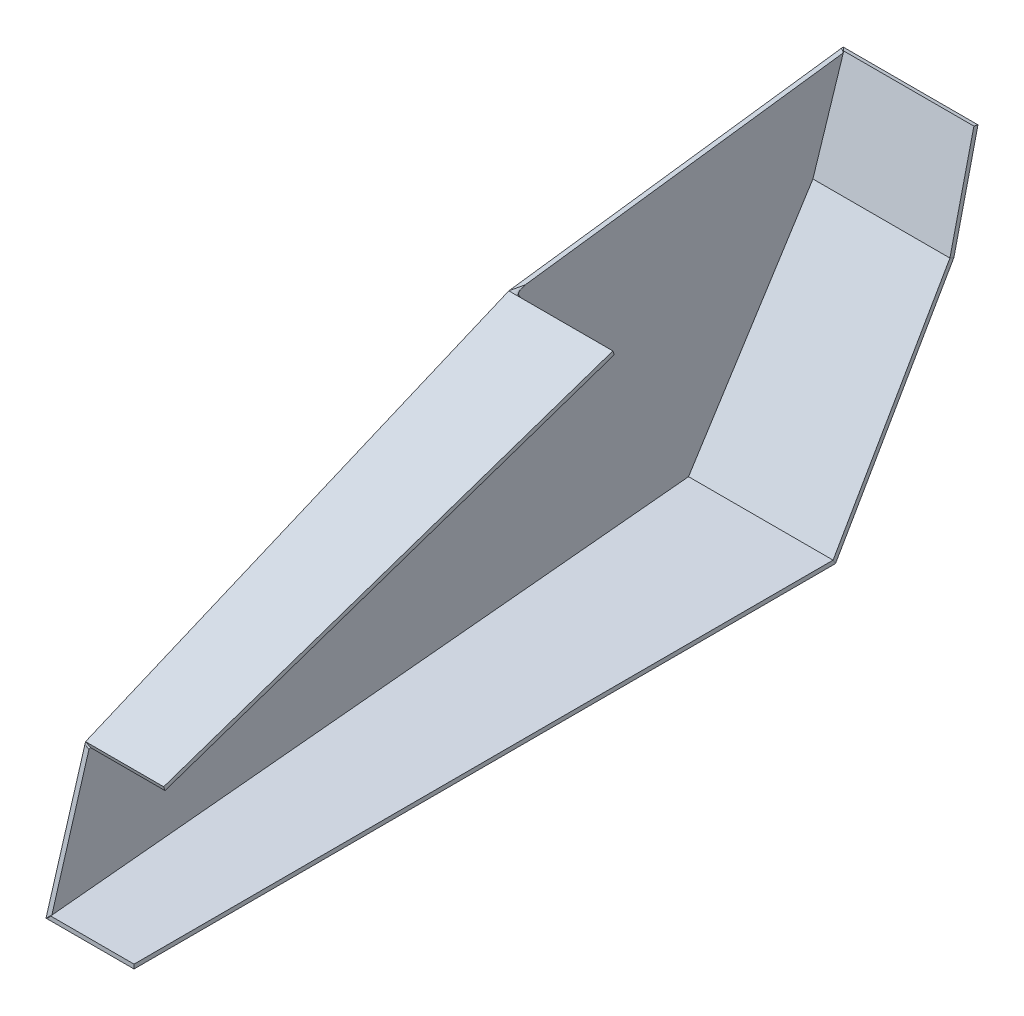
ISO-10303-21;
HEADER;
FILE_DESCRIPTION(('STEP AP214'),'2;1');
FILE_NAME('part.step','',(''),(''),'','','');
FILE_SCHEMA(('AUTOMOTIVE_DESIGN { 1 0 10303 214 1 1 1 1 }'));
ENDSEC;
DATA;
#1=APPLICATION_CONTEXT('core data for automotive mechanical design processes');
#2=APPLICATION_PROTOCOL_DEFINITION('international standard','automotive_design',2000,#1);
#3=PRODUCT_CONTEXT('',#1,'mechanical');
#4=PRODUCT('Part','Part','',(#3));
#5=PRODUCT_RELATED_PRODUCT_CATEGORY('part','',(#4));
#6=PRODUCT_DEFINITION_FORMATION('','',#4);
#7=PRODUCT_DEFINITION_CONTEXT('part definition',#1,'design');
#8=PRODUCT_DEFINITION('design','',#6,#7);
#9=PRODUCT_DEFINITION_SHAPE('','',#8);
#10=(LENGTH_UNIT() NAMED_UNIT(*) SI_UNIT(.MILLI.,.METRE.));
#11=(NAMED_UNIT(*) PLANE_ANGLE_UNIT() SI_UNIT($,.RADIAN.));
#12=(NAMED_UNIT(*) SI_UNIT($,.STERADIAN.) SOLID_ANGLE_UNIT());
#13=UNCERTAINTY_MEASURE_WITH_UNIT(LENGTH_MEASURE(1.E-05),#10,'distance_accuracy_value','');
#14=(GEOMETRIC_REPRESENTATION_CONTEXT(3) GLOBAL_UNCERTAINTY_ASSIGNED_CONTEXT((#13)) GLOBAL_UNIT_ASSIGNED_CONTEXT((#10,
#11,#12)) REPRESENTATION_CONTEXT('',''));
#15=CARTESIAN_POINT('',(0.,0.,0.));
#16=DIRECTION('',(0.,0.,1.));
#17=DIRECTION('',(1.,0.,0.));
#18=AXIS2_PLACEMENT_3D('',#15,#16,#17);
#19=CARTESIAN_POINT('',(0.,110.310015798724,-40.4378275892309));
#20=DIRECTION('',(0.,0.946709580585224,0.322088450628316));
#21=DIRECTION('',(0.,-0.322088450628316,0.946709580585224));
#22=AXIS2_PLACEMENT_3D('',#19,#20,#21);
#23=PLANE('',#22);
#24=DIRECTION('',(-0.0545658529524883,0.321608594898021,-0.945299148089793));
#25=VECTOR('',#24,1.);
#26=CARTESIAN_POINT('',(24.5252101587905,1.78945060946269,278.534984241748));
#27=LINE('',#26,#25);
#28=CARTESIAN_POINT('',(24.5252101587905,1.78945060946267,278.534984241748));
#29=VERTEX_POINT('',#28);
#30=CARTESIAN_POINT('',(6.11302436407989,110.310015798724,-40.4378275892309));
#31=VERTEX_POINT('',#30);
#32=EDGE_CURVE('E628',#29,#31,#27,.T.);
#33=ORIENTED_EDGE('',*,*,#32,.F.);
#34=DIRECTION('',(-1.,0.,0.));
#35=VECTOR('',#34,1.);
#36=CARTESIAN_POINT('',(52.2626050793952,1.78945060946263,278.534984241748));
#37=LINE('',#36,#35);
#38=CARTESIAN_POINT('',(80.,1.78945060946263,278.534984241748));
#39=VERTEX_POINT('',#38);
#40=EDGE_CURVE('E609',#39,#29,#37,.T.);
#41=ORIENTED_EDGE('',*,*,#40,.F.);
#42=DIRECTION('',(0.,-0.322088450628316,0.946709580585224));
#43=VECTOR('',#42,1.);
#44=CARTESIAN_POINT('',(80.,56.0497332040935,119.048578326258));
#45=LINE('',#44,#43);
#46=CARTESIAN_POINT('',(80.,110.310015798724,-40.4378275892308));
#47=VERTEX_POINT('',#46);
#48=EDGE_CURVE('E489',#47,#39,#45,.T.);
#49=ORIENTED_EDGE('',*,*,#48,.F.);
#50=DIRECTION('',(1.,0.,0.));
#51=VECTOR('',#50,1.);
#52=CARTESIAN_POINT('',(48.6881632774124,110.310015798724,-40.4378275892309));
#53=LINE('',#52,#51);
#54=CARTESIAN_POINT('',(17.3763265548247,110.310015798724,-40.4378275892309));
#55=VERTEX_POINT('',#54);
#56=EDGE_CURVE('E487',#55,#47,#53,.T.);
#57=ORIENTED_EDGE('',*,*,#56,.F.);
#58=DIRECTION('',(1.,0.,0.));
#59=VECTOR('',#58,1.);
#60=CARTESIAN_POINT('',(11.7446754594523,110.310015798724,-40.4378275892309));
#61=LINE('',#60,#59);
#62=EDGE_CURVE('E470',#31,#55,#61,.T.);
#63=ORIENTED_EDGE('',*,*,#62,.F.);
#64=EDGE_LOOP('',(#33,#41,#49,#57,#63));
#65=FACE_BOUND('',#64,.T.);
#66=ADVANCED_FACE('F398',(#65),#23,.T.);
#67=CARTESIAN_POINT('',(0.,-99.7780619293242,299.564386351645));
#68=DIRECTION('',(0.,-0.999999864234865,-0.00052108564756985));
#69=DIRECTION('',(0.,0.00052108564756985,-0.999999864234865));
#70=AXIS2_PLACEMENT_3D('',#67,#68,#69);
#71=PLANE('',#70);
#72=DIRECTION('',(0.087110660113036,-0.000519104814101098,0.996198506034246));
#73=VECTOR('',#72,1.);
#74=CARTESIAN_POINT('',(-4.29862651379476,-99.6482857257989,50.5147598430838));
#75=LINE('',#74,#73);
#76=CARTESIAN_POINT('',(-26.0762915420538,-99.5185095222735,-198.534866665478));
#77=VERTEX_POINT('',#76);
#78=CARTESIAN_POINT('',(17.4790385144642,-99.7780619293242,299.564386351645));
#79=VERTEX_POINT('',#78);
#80=EDGE_CURVE('E624',#77,#79,#75,.T.);
#81=ORIENTED_EDGE('',*,*,#80,.F.);
#82=DIRECTION('',(-1.,0.,0.));
#83=VECTOR('',#82,1.);
#84=CARTESIAN_POINT('',(40.,-99.5185095222735,-198.534866665478));
#85=LINE('',#84,#83);
#86=CARTESIAN_POINT('',(80.,-99.5185095222736,-198.534866665478));
#87=VERTEX_POINT('',#86);
#88=EDGE_CURVE('E627',#87,#77,#85,.T.);
#89=ORIENTED_EDGE('',*,*,#88,.F.);
#90=DIRECTION('',(0.,0.000521085647569877,-0.999999864234865));
#91=VECTOR('',#90,1.);
#92=CARTESIAN_POINT('',(80.,-99.6482857257989,50.5147598430839));
#93=LINE('',#92,#91);
#94=CARTESIAN_POINT('',(80.,-99.7780619293242,299.564386351645));
#95=VERTEX_POINT('',#94);
#96=EDGE_CURVE('E558',#95,#87,#93,.T.);
#97=ORIENTED_EDGE('',*,*,#96,.F.);
#98=DIRECTION('',(1.,0.,0.));
#99=VECTOR('',#98,1.);
#100=CARTESIAN_POINT('',(49.2282466567951,-99.7780619293242,299.564386351645));
#101=LINE('',#100,#99);
#102=CARTESIAN_POINT('',(18.4564933135901,-99.7780619293242,299.564386351645));
#103=VERTEX_POINT('',#102);
#104=EDGE_CURVE('E568',#103,#95,#101,.T.);
#105=ORIENTED_EDGE('',*,*,#104,.F.);
#106=DIRECTION('',(1.,0.,0.));
#107=VECTOR('',#106,1.);
#108=CARTESIAN_POINT('',(17.9677659140272,-99.7780619293242,299.564386351645));
#109=LINE('',#108,#107);
#110=EDGE_CURVE('E578',#79,#103,#109,.T.);
#111=ORIENTED_EDGE('',*,*,#110,.F.);
#112=EDGE_LOOP('',(#81,#89,#97,#105,#111));
#113=FACE_BOUND('',#112,.T.);
#114=ADVANCED_FACE('F804',(#113),#71,.T.);
#115=CARTESIAN_POINT('',(0.,0.,0.));
#116=DIRECTION('',(0.992432509138968,-0.0868265938642405,-0.086826593864241));
#117=DIRECTION('',(-0.0871557427476515,0.,-0.996194698091746));
#118=AXIS2_PLACEMENT_3D('',#115,#116,#117);
#119=PLANE('',#118);
#120=DIRECTION('',(0.0839663559491868,-0.0360755085509896,0.995815348722544));
#121=VECTOR('',#120,1.);
#122=CARTESIAN_POINT('',(-4.76922205797275,114.985490510171,-169.497948076286));
#123=LINE('',#122,#121);
#124=CARTESIAN_POINT('',(-15.6514684800254,119.660965221617,-298.558068563341));
#125=VERTEX_POINT('',#124);
#126=EDGE_CURVE('E483',#125,#31,#123,.T.);
#127=ORIENTED_EDGE('',*,*,#126,.F.);
#128=DIRECTION('',(0.0839663559491908,-0.0360755085509986,0.995815348722543));
#129=VECTOR('',#128,1.);
#130=CARTESIAN_POINT('',(-15.6998375453002,119.68174662398,-299.13171091163));
#131=LINE('',#130,#129);
#132=CARTESIAN_POINT('',(-15.7482066105749,119.702528026343,-299.70535325992));
#133=VERTEX_POINT('',#132);
#134=EDGE_CURVE('E518',#133,#125,#131,.T.);
#135=ORIENTED_EDGE('',*,*,#134,.F.);
#136=DIRECTION('',(-0.0650839922381132,-0.971565120847082,0.227651685492871));
#137=VECTOR('',#136,1.);
#138=CARTESIAN_POINT('',(-20.555304777843,47.9428102954658,-282.891019005429));
#139=LINE('',#138,#137);
#140=CARTESIAN_POINT('',(-20.6427459229518,46.6375005903725,-282.585166162343));
#141=VERTEX_POINT('',#140);
#142=EDGE_CURVE('E637',#133,#141,#139,.T.);
#143=ORIENTED_EDGE('',*,*,#142,.T.);
#144=DIRECTION('',(-0.0322106718301427,-0.866429327691845,0.498259663966198));
#145=VECTOR('',#144,1.);
#146=CARTESIAN_POINT('',(-26.0492366756166,-98.7907653180672,-198.953372331262));
#147=LINE('',#146,#145);
#148=EDGE_CURVE('E484',#141,#77,#147,.T.);
#149=ORIENTED_EDGE('',*,*,#148,.T.);
#150=ORIENTED_EDGE('',*,*,#80,.T.);
#151=DIRECTION('',(-0.0677772099004547,-0.976979126239648,0.202282072142153));
#152=VECTOR('',#151,1.);
#153=CARTESIAN_POINT('',(20.9518739563052,-49.7186431287114,289.199658290162));
#154=LINE('',#153,#152);
#155=CARTESIAN_POINT('',(24.4247093981462,0.340775671901398,278.834930228678));
#156=VERTEX_POINT('',#155);
#157=EDGE_CURVE('E588',#156,#79,#154,.T.);
#158=ORIENTED_EDGE('',*,*,#157,.F.);
#159=DIRECTION('',(-0.0677772099004537,-0.97697912623965,0.202282072142146));
#160=VECTOR('',#159,1.);
#161=CARTESIAN_POINT('',(24.4749597784683,1.06511314068204,278.684957235213));
#162=LINE('',#161,#160);
#163=EDGE_CURVE('E598',#29,#156,#162,.T.);
#164=ORIENTED_EDGE('',*,*,#163,.F.);
#165=ORIENTED_EDGE('',*,*,#32,.T.);
#166=EDGE_LOOP('',(#127,#135,#143,#149,#150,#158,#164,#165));
#167=FACE_BOUND('',#166,.T.);
#168=ADVANCED_FACE('F655',(#167),#119,.F.);
#169=CARTESIAN_POINT('',(0.,-99.5185095222735,-198.534866665478));
#170=DIRECTION('',(0.,-0.49851834429635,-0.866879149824257));
#171=DIRECTION('',(0.,0.866879149824257,-0.49851834429635));
#172=AXIS2_PLACEMENT_3D('',#169,#170,#171);
#173=PLANE('',#172);
#174=ORIENTED_EDGE('',*,*,#148,.F.);
#175=DIRECTION('',(-1.,0.,0.));
#176=VECTOR('',#175,1.);
#177=CARTESIAN_POINT('',(40.,46.6375005903725,-282.585166162343));
#178=LINE('',#177,#176);
#179=CARTESIAN_POINT('',(80.,46.6375005903725,-282.585166162343));
#180=VERTEX_POINT('',#179);
#181=EDGE_CURVE('E641',#180,#141,#178,.T.);
#182=ORIENTED_EDGE('',*,*,#181,.F.);
#183=DIRECTION('',(0.,0.866879149824257,-0.498518344296349));
#184=VECTOR('',#183,1.);
#185=CARTESIAN_POINT('',(80.,-26.4405044659506,-240.56001641391));
#186=LINE('',#185,#184);
#187=EDGE_CURVE('E548',#87,#180,#186,.T.);
#188=ORIENTED_EDGE('',*,*,#187,.F.);
#189=ORIENTED_EDGE('',*,*,#88,.T.);
#190=EDGE_LOOP('',(#174,#182,#188,#189));
#191=FACE_BOUND('',#190,.T.);
#192=ADVANCED_FACE('F660',(#191),#173,.T.);
#193=CARTESIAN_POINT('',(0.,46.6375005903725,-282.585166162343));
#194=DIRECTION('',(0.,-0.228135380560819,-0.973629420332177));
#195=DIRECTION('',(0.,0.973629420332177,-0.228135380560819));
#196=AXIS2_PLACEMENT_3D('',#193,#194,#195);
#197=PLANE('',#196);
#198=ORIENTED_EDGE('',*,*,#142,.F.);
#199=DIRECTION('',(-1.,0.,0.));
#200=VECTOR('',#199,1.);
#201=CARTESIAN_POINT('',(32.1258966947125,119.702528026343,-299.70535325992));
#202=LINE('',#201,#200);
#203=CARTESIAN_POINT('',(80.,119.702528026343,-299.70535325992));
#204=VERTEX_POINT('',#203);
#205=EDGE_CURVE('E528',#204,#133,#202,.T.);
#206=ORIENTED_EDGE('',*,*,#205,.F.);
#207=DIRECTION('',(0.,0.973629420332176,-0.22813538056082));
#208=VECTOR('',#207,1.);
#209=CARTESIAN_POINT('',(80.,83.1700143083578,-291.145259711131));
#210=LINE('',#209,#208);
#211=EDGE_CURVE('E538',#180,#204,#210,.T.);
#212=ORIENTED_EDGE('',*,*,#211,.F.);
#213=ORIENTED_EDGE('',*,*,#181,.T.);
#214=EDGE_LOOP('',(#198,#206,#212,#213));
#215=FACE_BOUND('',#214,.T.);
#216=ADVANCED_FACE('F664',(#215),#197,.T.);
#217=CARTESIAN_POINT('',(8.30819276683167,110.385571868704,-49.9741200248322));
#218=CARTESIAN_POINT('',(6.11302436407989,110.310015798724,-40.4378275892309));
#219=CARTESIAN_POINT('',(8.80288361532537,107.469887056969,-41.4040929411158));
#220=CARTESIAN_POINT('',(17.3763265548247,110.310015798724,-40.4378275892309));
#221=B_SPLINE_SURFACE_WITH_KNOTS('',1,1,((#217,#218),(#219,#220)),.UNSPECIFIED.,.F.,.F.,.F.,(2,
2),(2,2),(0.,1.),(0.,1.),.UNSPECIFIED.);
#222=DIRECTION('',(-0.0545658529524883,0.321608594898021,-0.945299148089793));
#223=VECTOR('',#222,1.);
#224=CARTESIAN_POINT('',(8.77667362524173,107.624367517311,-41.8581549589694));
#225=LINE('',#224,#223);
#226=CARTESIAN_POINT('',(8.80288361532537,107.469887056969,-41.4040929411158));
#227=VERTEX_POINT('',#226);
#228=CARTESIAN_POINT('',(8.30819276683167,110.385571868704,-49.9741200248322));
#229=VERTEX_POINT('',#228);
#230=EDGE_CURVE('E701',#227,#229,#225,.T.);
#231=DIRECTION('',(-0.224317755475283,-0.00772085094208945,0.97448547092261));
#232=VECTOR('',#231,1.);
#233=CARTESIAN_POINT('',(7.21060856545578,110.347793833714,-45.2059738070315));
#234=LINE('',#233,#232);
#235=EDGE_CURVE('E479',#229,#31,#234,.T.);
#236=DIRECTION('',(0.943882555833576,0.312680447584724,0.10637978422282));
#237=VECTOR('',#236,1.);
#238=CARTESIAN_POINT('',(13.089605085075,108.889951427847,-40.9209602651733));
#239=LINE('',#238,#237);
#240=EDGE_CURVE('E476',#227,#55,#239,.T.);
#241=ORIENTED_EDGE('',*,*,#230,.T.);
#242=ORIENTED_EDGE('',*,*,#235,.T.);
#243=ORIENTED_EDGE('',*,*,#62,.T.);
#244=ORIENTED_EDGE('',*,*,#240,.F.);
#245=EDGE_LOOP('',(#241,#242,#243,#244));
#246=FACE_BOUND('',#245,.T.);
#247=ADVANCED_FACE('F473',(#246),#221,.F.);
#248=CARTESIAN_POINT('',(-12.4815339952419,119.317720431062,-296.533932837826));
#249=DIRECTION('',(-0.0895955683767089,-0.995570037858072,-0.0285119947834629));
#250=DIRECTION('',(0.0839663559491868,-0.0360755085509896,0.995815348722544));
#251=AXIS2_PLACEMENT_3D('',#248,#249,#250);
#252=PLANE('',#251);
#253=DIRECTION('',(-0.0839663559491868,0.0360755085509896,-0.995815348722544));
#254=VECTOR('',#253,1.);
#255=CARTESIAN_POINT('',(9.09032189149679,110.049536017132,-40.6983073708237));
#256=LINE('',#255,#254);
#257=CARTESIAN_POINT('',(-12.4815339952419,119.317720431062,-296.533932837826));
#258=VERTEX_POINT('',#257);
#259=EDGE_CURVE('E752',#229,#258,#256,.T.);
#260=ORIENTED_EDGE('',*,*,#259,.T.);
#261=DIRECTION('',(-0.839340817729522,0.0908849582126281,-0.535954210790275));
#262=VECTOR('',#261,1.);
#263=CARTESIAN_POINT('',(-14.0665012376337,119.48934282634,-297.546000700584));
#264=LINE('',#263,#262);
#265=EDGE_CURVE('E499',#258,#125,#264,.T.);
#266=ORIENTED_EDGE('',*,*,#265,.T.);
#267=ORIENTED_EDGE('',*,*,#126,.T.);
#268=ORIENTED_EDGE('',*,*,#235,.F.);
#269=EDGE_LOOP('',(#260,#266,#267,#268));
#270=FACE_BOUND('',#269,.T.);
#271=ADVANCED_FACE('F853',(#270),#252,.F.);
#272=CARTESIAN_POINT('',(-12.409908638316,120.386934168026,-296.784464998923));
#273=CARTESIAN_POINT('',(-15.7482066105749,119.702528026343,-299.70535325992));
#274=CARTESIAN_POINT('',(-12.4815339952419,119.317720431062,-296.533932837826));
#275=CARTESIAN_POINT('',(-15.6514684800254,119.660965221617,-298.558068563341));
#276=B_SPLINE_SURFACE_WITH_KNOTS('',1,1,((#272,#273),(#274,#275)),.UNSPECIFIED.,.F.,.F.,.F.,(2,
2),(2,2),(0.,1.),(0.,1.),.UNSPECIFIED.);
#277=DIRECTION('',(-0.0650839922381132,-0.971565120847082,0.227651685492871));
#278=VECTOR('',#277,1.);
#279=CARTESIAN_POINT('',(-17.231147588913,48.4161247171829,-279.920668917518));
#280=LINE('',#279,#278);
#281=CARTESIAN_POINT('',(-12.409908638316,120.386934168025,-296.784464998923));
#282=VERTEX_POINT('',#281);
#283=EDGE_CURVE('E735',#282,#258,#280,.T.);
#284=DIRECTION('',(-0.743788958182735,-0.152489003476044,-0.650788052674851));
#285=VECTOR('',#284,1.);
#286=CARTESIAN_POINT('',(-14.0790576244455,120.044731097184,-298.244909129421));
#287=LINE('',#286,#285);
#288=EDGE_CURVE('E512',#282,#133,#287,.T.);
#289=ORIENTED_EDGE('',*,*,#283,.F.);
#290=ORIENTED_EDGE('',*,*,#288,.T.);
#291=ORIENTED_EDGE('',*,*,#134,.T.);
#292=ORIENTED_EDGE('',*,*,#265,.F.);
#293=EDGE_LOOP('',(#289,#290,#291,#292));
#294=FACE_BOUND('',#293,.T.);
#295=ADVANCED_FACE('F842',(#294),#276,.F.);
#296=CARTESIAN_POINT('',(80.,120.386934168025,-296.784464998923));
#297=DIRECTION('',(0.,-0.973629420332177,0.228135380560816));
#298=DIRECTION('',(-1.,0.,0.));
#299=AXIS2_PLACEMENT_3D('',#296,#297,#298);
#300=PLANE('',#299);
#301=DIRECTION('',(1.,0.,0.));
#302=VECTOR('',#301,1.);
#303=CARTESIAN_POINT('',(0.,120.386934168025,-296.784464998923));
#304=LINE('',#303,#302);
#305=CARTESIAN_POINT('',(80.,120.386934168025,-296.784464998923));
#306=VERTEX_POINT('',#305);
#307=EDGE_CURVE('E742',#282,#306,#304,.T.);
#308=ORIENTED_EDGE('',*,*,#307,.T.);
#309=DIRECTION('',(0.,-0.228135380560816,-0.973629420332177));
#310=VECTOR('',#309,1.);
#311=CARTESIAN_POINT('',(80.,120.044731097184,-298.244909129421));
#312=LINE('',#311,#310);
#313=EDGE_CURVE('E523',#306,#204,#312,.T.);
#314=ORIENTED_EDGE('',*,*,#313,.T.);
#315=ORIENTED_EDGE('',*,*,#205,.T.);
#316=ORIENTED_EDGE('',*,*,#288,.F.);
#317=EDGE_LOOP('',(#308,#314,#315,#316));
#318=FACE_BOUND('',#317,.T.);
#319=ADVANCED_FACE('F852',(#318),#300,.F.);
#320=CARTESIAN_POINT('',(80.,47.7510046659383,-279.764821720586));
#321=DIRECTION('',(-1.,0.,0.));
#322=DIRECTION('',(0.,0.973629420332177,-0.228135380560819));
#323=AXIS2_PLACEMENT_3D('',#320,#321,#322);
#324=PLANE('',#323);
#325=DIRECTION('',(0.,0.973629420332177,-0.228135380560819));
#326=VECTOR('',#325,1.);
#327=CARTESIAN_POINT('',(80.,47.321906732055,-279.664277901347));
#328=LINE('',#327,#326);
#329=CARTESIAN_POINT('',(80.,47.7510046659383,-279.764821720586));
#330=VERTEX_POINT('',#329);
#331=EDGE_CURVE('E672',#306,#330,#328,.F.);
#332=ORIENTED_EDGE('',*,*,#331,.T.);
#333=DIRECTION('',(0.,-0.367226515962012,-0.930131542296251));
#334=VECTOR('',#333,1.);
#335=CARTESIAN_POINT('',(80.,47.1942526281554,-281.174993941465));
#336=LINE('',#335,#334);
#337=EDGE_CURVE('E533',#330,#180,#336,.T.);
#338=ORIENTED_EDGE('',*,*,#337,.T.);
#339=ORIENTED_EDGE('',*,*,#211,.T.);
#340=ORIENTED_EDGE('',*,*,#313,.F.);
#341=EDGE_LOOP('',(#332,#338,#339,#340));
#342=FACE_BOUND('',#341,.T.);
#343=ADVANCED_FACE('F669',(#342),#324,.F.);
#344=CARTESIAN_POINT('',(80.,-96.5194137158899,-196.798874140429));
#345=DIRECTION('',(-1.,0.,0.));
#346=DIRECTION('',(0.,0.866879149824257,-0.49851834429635));
#347=AXIS2_PLACEMENT_3D('',#344,#345,#346);
#348=PLANE('',#347);
#349=DIRECTION('',(0.,0.866879149824257,-0.49851834429635));
#350=VECTOR('',#349,1.);
#351=CARTESIAN_POINT('',(80.,-98.0229544893845,-195.934229216005));
#352=LINE('',#351,#350);
#353=CARTESIAN_POINT('',(80.,-96.51941371589,-196.798874140429));
#354=VERTEX_POINT('',#353);
#355=EDGE_CURVE('E679',#330,#354,#352,.F.);
#356=ORIENTED_EDGE('',*,*,#355,.T.);
#357=DIRECTION('',(0.,-0.865467087280574,-0.500965788087451));
#358=VECTOR('',#357,1.);
#359=CARTESIAN_POINT('',(80.,-98.0189616190818,-197.666870402953));
#360=LINE('',#359,#358);
#361=EDGE_CURVE('E543',#354,#87,#360,.T.);
#362=ORIENTED_EDGE('',*,*,#361,.T.);
#363=ORIENTED_EDGE('',*,*,#187,.T.);
#364=ORIENTED_EDGE('',*,*,#337,.F.);
#365=EDGE_LOOP('',(#356,#362,#363,#364));
#366=FACE_BOUND('',#365,.T.);
#367=ADVANCED_FACE('F676',(#366),#348,.F.);
#368=CARTESIAN_POINT('',(80.,-96.7780623366196,299.565949608588));
#369=DIRECTION('',(-1.,0.,0.));
#370=DIRECTION('',(0.,0.00052108564756986,-0.999999864234865));
#371=AXIS2_PLACEMENT_3D('',#368,#369,#370);
#372=PLANE('',#371);
#373=DIRECTION('',(0.,0.00052108564756985,-0.999999864234865));
#374=VECTOR('',#373,1.);
#375=CARTESIAN_POINT('',(80.,-96.7780623366196,299.565949608588));
#376=LINE('',#375,#374);
#377=CARTESIAN_POINT('',(80.,-96.7780623366196,299.565949608588));
#378=VERTEX_POINT('',#377);
#379=EDGE_CURVE('E740',#354,#378,#376,.F.);
#380=ORIENTED_EDGE('',*,*,#379,.T.);
#381=DIRECTION('',(0.,-0.999999864234865,-0.000521085647575689));
#382=VECTOR('',#381,1.);
#383=CARTESIAN_POINT('',(80.,-98.2780621329719,299.565167980117));
#384=LINE('',#383,#382);
#385=EDGE_CURVE('E553',#378,#95,#384,.T.);
#386=ORIENTED_EDGE('',*,*,#385,.T.);
#387=ORIENTED_EDGE('',*,*,#96,.T.);
#388=ORIENTED_EDGE('',*,*,#361,.F.);
#389=EDGE_LOOP('',(#380,#386,#387,#388));
#390=FACE_BOUND('',#389,.T.);
#391=ADVANCED_FACE('F802',(#390),#372,.F.);
#392=CARTESIAN_POINT('',(20.76451682002,-96.7780623366196,299.565949608588));
#393=DIRECTION('',(0.,0.000521085647575692,-0.999999864234865));
#394=DIRECTION('',(1.,0.,0.));
#395=AXIS2_PLACEMENT_3D('',#392,#393,#394);
#396=PLANE('',#395);
#397=DIRECTION('',(1.,0.,0.));
#398=VECTOR('',#397,1.);
#399=CARTESIAN_POINT('',(0.,-96.7780623366196,299.565949608588));
#400=LINE('',#399,#398);
#401=CARTESIAN_POINT('',(20.76451682002,-96.7780623366196,299.565949608588));
#402=VERTEX_POINT('',#401);
#403=EDGE_CURVE('E708',#378,#402,#400,.F.);
#404=ORIENTED_EDGE('',*,*,#403,.T.);
#405=DIRECTION('',(-0.609765731933374,-0.792581593016341,-0.000413002948724894));
#406=VECTOR('',#405,1.);
#407=CARTESIAN_POINT('',(19.610505066805,-98.2780621329719,299.565167980117));
#408=LINE('',#407,#406);
#409=EDGE_CURVE('E563',#402,#103,#408,.T.);
#410=ORIENTED_EDGE('',*,*,#409,.T.);
#411=ORIENTED_EDGE('',*,*,#104,.T.);
#412=ORIENTED_EDGE('',*,*,#385,.F.);
#413=EDGE_LOOP('',(#404,#410,#411,#412));
#414=FACE_BOUND('',#413,.T.);
#415=ADVANCED_FACE('F799',(#414),#396,.F.);
#416=CARTESIAN_POINT('',(20.6825632861847,-96.7775739638545,298.628728057689));
#417=CARTESIAN_POINT('',(17.4790385144642,-99.7780619293242,299.564386351645));
#418=CARTESIAN_POINT('',(20.76451682002,-96.7780623366196,299.565949608588));
#419=CARTESIAN_POINT('',(18.4564933135901,-99.7780619293242,299.564386351645));
#420=B_SPLINE_SURFACE_WITH_KNOTS('',1,1,((#416,#417),(#418,#419)),.UNSPECIFIED.,.F.,.F.,.F.,(2,
2),(2,2),(0.,1.),(0.,1.),.UNSPECIFIED.);
#421=DIRECTION('',(0.087110660113036,-0.000519104814101307,0.996198506034246));
#422=VECTOR('',#421,1.);
#423=CARTESIAN_POINT('',(20.6069501200766,-96.7771233742426,297.764015024684));
#424=LINE('',#423,#422);
#425=CARTESIAN_POINT('',(20.6825632861847,-96.7775739638545,298.628728057689));
#426=VERTEX_POINT('',#425);
#427=EDGE_CURVE('E14',#426,#402,#424,.T.);
#428=DIRECTION('',(-0.713818915757634,-0.668577650830887,0.208486163368335));
#429=VECTOR('',#428,1.);
#430=CARTESIAN_POINT('',(19.0808009003245,-98.2778179465894,299.096557204667));
#431=LINE('',#430,#429);
#432=EDGE_CURVE('E573',#426,#79,#431,.T.);
#433=ORIENTED_EDGE('',*,*,#427,.F.);
#434=ORIENTED_EDGE('',*,*,#432,.T.);
#435=ORIENTED_EDGE('',*,*,#110,.T.);
#436=ORIENTED_EDGE('',*,*,#409,.F.);
#437=EDGE_LOOP('',(#433,#434,#435,#436));
#438=FACE_BOUND('',#437,.T.);
#439=ADVANCED_FACE('F795',(#438),#420,.F.);
#440=CARTESIAN_POINT('',(27.2920641529913,-1.50448155983134,278.902576256418));
#441=DIRECTION('',(-0.102391233131742,-0.194866440132589,-0.97547070990769));
#442=DIRECTION('',(-0.0677772099004546,-0.976979126239648,0.202282072142153));
#443=AXIS2_PLACEMENT_3D('',#440,#441,#442);
#444=PLANE('',#443);
#445=DIRECTION('',(0.0677772099004547,0.976979126239648,-0.202282072142153));
#446=VECTOR('',#445,1.);
#447=CARTESIAN_POINT('',(25.0643002533384,-33.616733323333,285.551370128682));
#448=LINE('',#447,#446);
#449=CARTESIAN_POINT('',(27.2920641529913,-1.50448155983133,278.902576256418));
#450=VERTEX_POINT('',#449);
#451=EDGE_CURVE('E728',#426,#450,#448,.T.);
#452=ORIENTED_EDGE('',*,*,#451,.T.);
#453=DIRECTION('',(-0.84075177638882,0.541057325694415,-0.0198348383268284));
#454=VECTOR('',#453,1.);
#455=CARTESIAN_POINT('',(25.8583867755687,-0.581852943964969,278.868753242548));
#456=LINE('',#455,#454);
#457=EDGE_CURVE('E583',#450,#156,#456,.T.);
#458=ORIENTED_EDGE('',*,*,#457,.T.);
#459=ORIENTED_EDGE('',*,*,#157,.T.);
#460=ORIENTED_EDGE('',*,*,#432,.F.);
#461=EDGE_LOOP('',(#452,#458,#459,#460));
#462=FACE_BOUND('',#461,.T.);
#463=ADVANCED_FACE('F793',(#462),#444,.F.);
#464=CARTESIAN_POINT('',(27.215069410036,-1.05067813229309,277.568718889863));
#465=CARTESIAN_POINT('',(24.5252101587905,1.78945060946269,278.534984241748));
#466=CARTESIAN_POINT('',(27.2920641529913,-1.50448155983134,278.902576256418));
#467=CARTESIAN_POINT('',(24.4247093981462,0.340775671901397,278.834930228678));
#468=B_SPLINE_SURFACE_WITH_KNOTS('',1,1,((#464,#465),(#466,#467)),.UNSPECIFIED.,.F.,.F.,.F.,(2,
2),(2,2),(0.,1.),(0.,1.),.UNSPECIFIED.);
#469=DIRECTION('',(-0.0545658529524883,0.321608594898021,-0.945299148089793));
#470=VECTOR('',#469,1.);
#471=CARTESIAN_POINT('',(8.77667362524173,107.624367517311,-41.8581549589694));
#472=LINE('',#471,#470);
#473=CARTESIAN_POINT('',(27.215069410036,-1.05067813229309,277.568718889863));
#474=VERTEX_POINT('',#473);
#475=EDGE_CURVE('E408',#450,#474,#472,.T.);
#476=DIRECTION('',(-0.66757309401913,0.704867189860829,0.239809109083502));
#477=VECTOR('',#476,1.);
#478=CARTESIAN_POINT('',(25.8701397844132,0.369386238584797,278.051851565805));
#479=LINE('',#478,#477);
#480=EDGE_CURVE('E593',#474,#29,#479,.T.);
#481=ORIENTED_EDGE('',*,*,#475,.T.);
#482=ORIENTED_EDGE('',*,*,#480,.T.);
#483=ORIENTED_EDGE('',*,*,#163,.T.);
#484=ORIENTED_EDGE('',*,*,#457,.F.);
#485=EDGE_LOOP('',(#481,#482,#483,#484));
#486=FACE_BOUND('',#485,.T.);
#487=ADVANCED_FACE('F789',(#486),#468,.F.);
#488=CARTESIAN_POINT('',(80.0000000000001,-1.05067813229306,277.568718889863));
#489=DIRECTION('',(0.,0.322088450628292,-0.946709580585232));
#490=DIRECTION('',(-1.,0.,0.));
#491=AXIS2_PLACEMENT_3D('',#488,#489,#490);
#492=PLANE('',#491);
#493=DIRECTION('',(1.,0.,0.));
#494=VECTOR('',#493,1.);
#495=CARTESIAN_POINT('',(0.,-1.05067813229306,277.568718889863));
#496=LINE('',#495,#494);
#497=CARTESIAN_POINT('',(80.0000000000001,-1.05067813229306,277.568718889863));
#498=VERTEX_POINT('',#497);
#499=EDGE_CURVE('E763',#474,#498,#496,.T.);
#500=ORIENTED_EDGE('',*,*,#499,.T.);
#501=DIRECTION('',(0.,0.946709580585232,0.322088450628292));
#502=VECTOR('',#501,1.);
#503=CARTESIAN_POINT('',(80.,0.369386238584783,278.051851565805));
#504=LINE('',#503,#502);
#505=EDGE_CURVE('E601',#498,#39,#504,.T.);
#506=ORIENTED_EDGE('',*,*,#505,.T.);
#507=ORIENTED_EDGE('',*,*,#40,.T.);
#508=ORIENTED_EDGE('',*,*,#480,.F.);
#509=EDGE_LOOP('',(#500,#506,#507,#508));
#510=FACE_BOUND('',#509,.T.);
#511=ADVANCED_FACE('F806',(#510),#492,.F.);
#512=CARTESIAN_POINT('',(80.,107.469887056969,-41.4040929411158));
#513=DIRECTION('',(-1.,0.,0.));
#514=DIRECTION('',(0.,-0.322088450628316,0.946709580585224));
#515=AXIS2_PLACEMENT_3D('',#512,#513,#514);
#516=PLANE('',#515);
#517=DIRECTION('',(0.,-0.322088450628316,0.946709580585224));
#518=VECTOR('',#517,1.);
#519=CARTESIAN_POINT('',(80.,107.469887056969,-41.4040929411158));
#520=LINE('',#519,#518);
#521=CARTESIAN_POINT('',(80.,107.469887056969,-41.4040929411158));
#522=VERTEX_POINT('',#521);
#523=EDGE_CURVE('E759',#498,#522,#520,.F.);
#524=ORIENTED_EDGE('',*,*,#523,.T.);
#525=DIRECTION('',(0.,0.946709580585216,0.322088450628339));
#526=VECTOR('',#525,1.);
#527=CARTESIAN_POINT('',(80.,108.889951427846,-40.9209602651733));
#528=LINE('',#527,#526);
#529=EDGE_CURVE('E604',#522,#47,#528,.T.);
#530=ORIENTED_EDGE('',*,*,#529,.T.);
#531=ORIENTED_EDGE('',*,*,#48,.T.);
#532=ORIENTED_EDGE('',*,*,#505,.F.);
#533=EDGE_LOOP('',(#524,#530,#531,#532));
#534=FACE_BOUND('',#533,.T.);
#535=ADVANCED_FACE('F782',(#534),#516,.F.);
#536=CARTESIAN_POINT('',(8.80288361532537,107.469887056969,-41.4040929411158));
#537=DIRECTION('',(0.,-0.322088450628318,0.946709580585223));
#538=DIRECTION('',(1.,0.,0.));
#539=AXIS2_PLACEMENT_3D('',#536,#537,#538);
#540=PLANE('',#539);
#541=DIRECTION('',(1.,0.,0.));
#542=VECTOR('',#541,1.);
#543=CARTESIAN_POINT('',(0.,107.469887056969,-41.4040929411158));
#544=LINE('',#543,#542);
#545=EDGE_CURVE('E497',#522,#227,#544,.F.);
#546=ORIENTED_EDGE('',*,*,#545,.T.);
#547=ORIENTED_EDGE('',*,*,#240,.T.);
#548=ORIENTED_EDGE('',*,*,#56,.T.);
#549=ORIENTED_EDGE('',*,*,#529,.F.);
#550=EDGE_LOOP('',(#546,#547,#548,#549));
#551=FACE_BOUND('',#550,.T.);
#552=ADVANCED_FACE('F495',(#551),#540,.F.);
#553=CARTESIAN_POINT('',(0.,107.469887056969,-41.4040929411158));
#554=DIRECTION('',(0.,0.946709580585224,0.322088450628316));
#555=DIRECTION('',(0.,-0.322088450628316,0.946709580585224));
#556=AXIS2_PLACEMENT_3D('',#553,#554,#555);
#557=PLANE('',#556);
#558=DIRECTION('',(-0.0545658529524883,0.321608594898021,-0.945299148089793));
#559=VECTOR('',#558,1.);
#560=CARTESIAN_POINT('',(8.77667362524173,107.624367517311,-41.8581549589694));
#561=LINE('',#560,#559);
#562=EDGE_CURVE('E751',#474,#227,#561,.T.);
#563=ORIENTED_EDGE('',*,*,#562,.T.);
#564=ORIENTED_EDGE('',*,*,#545,.F.);
#565=ORIENTED_EDGE('',*,*,#523,.F.);
#566=ORIENTED_EDGE('',*,*,#499,.F.);
#567=EDGE_LOOP('',(#563,#564,#565,#566));
#568=FACE_BOUND('',#567,.T.);
#569=ADVANCED_FACE('F785',(#568),#557,.F.);
#570=CARTESIAN_POINT('',(0.,-96.7780623366196,299.565949608588));
#571=DIRECTION('',(0.,-0.999999864234865,-0.00052108564756985));
#572=DIRECTION('',(0.,0.00052108564756985,-0.999999864234865));
#573=AXIS2_PLACEMENT_3D('',#570,#571,#572);
#574=PLANE('',#573);
#575=DIRECTION('',(0.087110660113036,-0.000519104814101307,0.996198506034246));
#576=VECTOR('',#575,1.);
#577=CARTESIAN_POINT('',(20.6069501200766,-96.7771233742426,297.764015024684));
#578=LINE('',#577,#576);
#579=CARTESIAN_POINT('',(-22.6391494089085,-96.51941371589,-196.798874140429));
#580=VERTEX_POINT('',#579);
#581=EDGE_CURVE('E722',#580,#426,#578,.T.);
#582=ORIENTED_EDGE('',*,*,#581,.T.);
#583=ORIENTED_EDGE('',*,*,#427,.T.);
#584=ORIENTED_EDGE('',*,*,#403,.F.);
#585=ORIENTED_EDGE('',*,*,#379,.F.);
#586=DIRECTION('',(-1.,0.,0.));
#587=VECTOR('',#586,1.);
#588=CARTESIAN_POINT('',(0.,-96.51941371589,-196.798874140429));
#589=LINE('',#588,#587);
#590=EDGE_CURVE('E733',#354,#580,#589,.T.);
#591=ORIENTED_EDGE('',*,*,#590,.T.);
#592=EDGE_LOOP('',(#582,#583,#584,#585,#591));
#593=FACE_BOUND('',#592,.T.);
#594=ADVANCED_FACE('F738',(#593),#574,.F.);
#595=CARTESIAN_POINT('',(2.97729752741691,-0.260479781592722,-0.260479781592723));
#596=DIRECTION('',(0.992432509138968,-0.0868265938642405,-0.086826593864241));
#597=DIRECTION('',(-0.0871557427476515,0.,-0.996194698091746));
#598=AXIS2_PLACEMENT_3D('',#595,#596,#597);
#599=PLANE('',#598);
#600=ORIENTED_EDGE('',*,*,#259,.F.);
#601=ORIENTED_EDGE('',*,*,#230,.F.);
#602=ORIENTED_EDGE('',*,*,#562,.F.);
#603=ORIENTED_EDGE('',*,*,#475,.F.);
#604=ORIENTED_EDGE('',*,*,#451,.F.);
#605=ORIENTED_EDGE('',*,*,#581,.F.);
#606=DIRECTION('',(-0.0322106718301427,-0.866429327691845,0.498259663966198));
#607=VECTOR('',#606,1.);
#608=CARTESIAN_POINT('',(-22.6714988217302,-97.3895750136769,-196.298468323157));
#609=LINE('',#608,#607);
#610=CARTESIAN_POINT('',(-17.2757031903068,47.7510046659383,-279.764821720586));
#611=VERTEX_POINT('',#610);
#612=EDGE_CURVE('E726',#611,#580,#609,.T.);
#613=ORIENTED_EDGE('',*,*,#612,.F.);
#614=DIRECTION('',(-0.0650839922381132,-0.971565120847082,0.227651685492871));
#615=VECTOR('',#614,1.);
#616=CARTESIAN_POINT('',(-17.231147588913,48.4161247171829,-279.920668917518));
#617=LINE('',#616,#615);
#618=EDGE_CURVE('E736',#258,#611,#617,.T.);
#619=ORIENTED_EDGE('',*,*,#618,.F.);
#620=EDGE_LOOP('',(#600,#601,#602,#603,#604,#605,#613,#619));
#621=FACE_BOUND('',#620,.T.);
#622=ADVANCED_FACE('F724',(#621),#599,.T.);
#623=CARTESIAN_POINT('',(0.,-98.0229544893845,-195.934229216005));
#624=DIRECTION('',(0.,-0.49851834429635,-0.866879149824257));
#625=DIRECTION('',(0.,0.866879149824257,-0.49851834429635));
#626=AXIS2_PLACEMENT_3D('',#623,#624,#625);
#627=PLANE('',#626);
#628=ORIENTED_EDGE('',*,*,#612,.T.);
#629=ORIENTED_EDGE('',*,*,#590,.F.);
#630=ORIENTED_EDGE('',*,*,#355,.F.);
#631=DIRECTION('',(-1.,0.,0.));
#632=VECTOR('',#631,1.);
#633=CARTESIAN_POINT('',(0.,47.7510046659383,-279.764821720586));
#634=LINE('',#633,#632);
#635=EDGE_CURVE('E734',#330,#611,#634,.T.);
#636=ORIENTED_EDGE('',*,*,#635,.T.);
#637=EDGE_LOOP('',(#628,#629,#630,#636));
#638=FACE_BOUND('',#637,.T.);
#639=ADVANCED_FACE('F732',(#638),#627,.F.);
#640=CARTESIAN_POINT('',(0.,47.321906732055,-279.664277901347));
#641=DIRECTION('',(0.,-0.228135380560819,-0.973629420332177));
#642=DIRECTION('',(0.,0.973629420332177,-0.228135380560819));
#643=AXIS2_PLACEMENT_3D('',#640,#641,#642);
#644=PLANE('',#643);
#645=ORIENTED_EDGE('',*,*,#618,.T.);
#646=ORIENTED_EDGE('',*,*,#635,.F.);
#647=ORIENTED_EDGE('',*,*,#331,.F.);
#648=ORIENTED_EDGE('',*,*,#307,.F.);
#649=ORIENTED_EDGE('',*,*,#283,.T.);
#650=EDGE_LOOP('',(#645,#646,#647,#648,#649));
#651=FACE_BOUND('',#650,.T.);
#652=ADVANCED_FACE('F816',(#651),#644,.F.);
#653=CLOSED_SHELL('',(#66,#114,#168,#192,#216,#247,#271,#295,#319,#343,#367,#391,#415,#439,#463,
#487,#511,#535,#552,#569,#594,#622,#639,#652));
#654=MANIFOLD_SOLID_BREP('B2',#653);
#655=ADVANCED_BREP_SHAPE_REPRESENTATION('',(#18,#654),#14);
#656=SHAPE_DEFINITION_REPRESENTATION(#9,#655);
ENDSEC;
END-ISO-10303-21;
